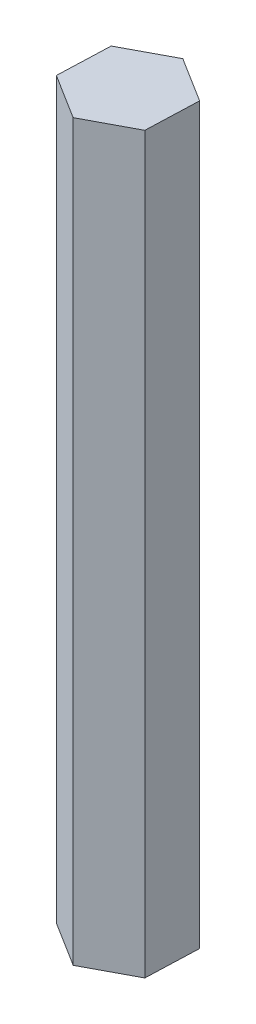
ISO-10303-21;
HEADER;
FILE_DESCRIPTION(('STEP AP214'),'2;1');
FILE_NAME('part.step','',(''),(''),'','','');
FILE_SCHEMA(('AUTOMOTIVE_DESIGN { 1 0 10303 214 1 1 1 1 }'));
ENDSEC;
DATA;
#1=APPLICATION_CONTEXT('core data for automotive mechanical design processes');
#2=APPLICATION_PROTOCOL_DEFINITION('international standard','automotive_design',2000,#1);
#3=PRODUCT_CONTEXT('',#1,'mechanical');
#4=PRODUCT('Part','Part','',(#3));
#5=PRODUCT_RELATED_PRODUCT_CATEGORY('part','',(#4));
#6=PRODUCT_DEFINITION_FORMATION('','',#4);
#7=PRODUCT_DEFINITION_CONTEXT('part definition',#1,'design');
#8=PRODUCT_DEFINITION('design','',#6,#7);
#9=PRODUCT_DEFINITION_SHAPE('','',#8);
#10=(LENGTH_UNIT() NAMED_UNIT(*) SI_UNIT(.MILLI.,.METRE.));
#11=(NAMED_UNIT(*) PLANE_ANGLE_UNIT() SI_UNIT($,.RADIAN.));
#12=(NAMED_UNIT(*) SI_UNIT($,.STERADIAN.) SOLID_ANGLE_UNIT());
#13=UNCERTAINTY_MEASURE_WITH_UNIT(LENGTH_MEASURE(1.E-05),#10,'distance_accuracy_value','');
#14=(GEOMETRIC_REPRESENTATION_CONTEXT(3) GLOBAL_UNCERTAINTY_ASSIGNED_CONTEXT((#13)) GLOBAL_UNIT_ASSIGNED_CONTEXT((#10,
#11,#12)) REPRESENTATION_CONTEXT('',''));
#15=CARTESIAN_POINT('',(0.,0.,0.));
#16=DIRECTION('',(0.,0.,1.));
#17=DIRECTION('',(1.,0.,0.));
#18=AXIS2_PLACEMENT_3D('',#15,#16,#17);
#19=CARTESIAN_POINT('',(3.10839587970355,50.8,1.94389001447493));
#20=DIRECTION('',(-0.999378260512364,0.,-0.0352575157275963));
#21=DIRECTION('',(-0.0352575157275963,0.,0.999378260512364));
#22=AXIS2_PLACEMENT_3D('',#19,#20,#21);
#23=PLANE('',#22);
#24=DIRECTION('',(0.0352575157275963,0.,-0.999378260512364));
#25=VECTOR('',#24,1.);
#26=CARTESIAN_POINT('',(3.10839587970355,0.,1.94389001447493));
#27=LINE('',#26,#25);
#28=CARTESIAN_POINT('',(3.10839587970355,0.,1.94389001447493));
#29=VERTEX_POINT('',#28);
#30=CARTESIAN_POINT('',(3.23765607454996,0.,-1.72000478960469));
#31=VERTEX_POINT('',#30);
#32=EDGE_CURVE('E117',#29,#31,#27,.T.);
#33=ORIENTED_EDGE('',*,*,#32,.T.);
#34=DIRECTION('',(0.,-1.,0.));
#35=VECTOR('',#34,1.);
#36=CARTESIAN_POINT('',(3.23765607454996,50.8,-1.72000478960469));
#37=LINE('',#36,#35);
#38=CARTESIAN_POINT('',(3.23765607454996,50.8,-1.72000478960469));
#39=VERTEX_POINT('',#38);
#40=EDGE_CURVE('E11',#39,#31,#37,.T.);
#41=ORIENTED_EDGE('',*,*,#40,.F.);
#42=DIRECTION('',(0.0352575157275963,0.,-0.999378260512364));
#43=VECTOR('',#42,1.);
#44=CARTESIAN_POINT('',(3.10839587970355,50.8,1.94389001447493));
#45=LINE('',#44,#43);
#46=CARTESIAN_POINT('',(3.10839587970355,50.8,1.94389001447493));
#47=VERTEX_POINT('',#46);
#48=EDGE_CURVE('E127',#47,#39,#45,.T.);
#49=ORIENTED_EDGE('',*,*,#48,.F.);
#50=DIRECTION('',(0.,-1.,0.));
#51=VECTOR('',#50,1.);
#52=CARTESIAN_POINT('',(3.10839587970355,50.8,1.94389001447493));
#53=LINE('',#52,#51);
#54=EDGE_CURVE('E113',#47,#29,#53,.T.);
#55=ORIENTED_EDGE('',*,*,#54,.T.);
#56=EDGE_LOOP('',(#33,#41,#49,#55));
#57=FACE_BOUND('',#56,.T.);
#58=ADVANCED_FACE('F33',(#57),#23,.F.);
#59=CARTESIAN_POINT('',(3.23765607454996,50.8,-1.72000478960469));
#60=DIRECTION('',(-0.53022303455061,0.,0.847858203729812));
#61=DIRECTION('',(0.847858203729812,0.,0.53022303455061));
#62=AXIS2_PLACEMENT_3D('',#59,#60,#61);
#63=PLANE('',#62);
#64=DIRECTION('',(-0.847858203729812,0.,-0.53022303455061));
#65=VECTOR('',#64,1.);
#66=CARTESIAN_POINT('',(3.23765607454996,0.,-1.72000478960469));
#67=LINE('',#66,#65);
#68=CARTESIAN_POINT('',(0.129260194846412,0.,-3.66389480407961));
#69=VERTEX_POINT('',#68);
#70=EDGE_CURVE('E120',#31,#69,#67,.T.);
#71=ORIENTED_EDGE('',*,*,#70,.T.);
#72=DIRECTION('',(0.,-1.,0.));
#73=VECTOR('',#72,1.);
#74=CARTESIAN_POINT('',(0.129260194846412,50.8,-3.66389480407961));
#75=LINE('',#74,#73);
#76=CARTESIAN_POINT('',(0.129260194846412,50.8,-3.66389480407961));
#77=VERTEX_POINT('',#76);
#78=EDGE_CURVE('E41',#77,#69,#75,.T.);
#79=ORIENTED_EDGE('',*,*,#78,.F.);
#80=DIRECTION('',(-0.847858203729812,0.,-0.53022303455061));
#81=VECTOR('',#80,1.);
#82=CARTESIAN_POINT('',(3.23765607454996,50.8,-1.72000478960469));
#83=LINE('',#82,#81);
#84=EDGE_CURVE('E86',#39,#77,#83,.T.);
#85=ORIENTED_EDGE('',*,*,#84,.F.);
#86=ORIENTED_EDGE('',*,*,#40,.T.);
#87=EDGE_LOOP('',(#71,#79,#85,#86));
#88=FACE_BOUND('',#87,.T.);
#89=ADVANCED_FACE('F151',(#88),#63,.F.);
#90=CARTESIAN_POINT('',(0.129260194846412,50.8,-3.66389480407961));
#91=DIRECTION('',(0.469155225961754,0.,0.883115719457408));
#92=DIRECTION('',(0.883115719457408,0.,-0.469155225961754));
#93=AXIS2_PLACEMENT_3D('',#90,#91,#92);
#94=PLANE('',#93);
#95=DIRECTION('',(-0.883115719457408,0.,0.469155225961754));
#96=VECTOR('',#95,1.);
#97=CARTESIAN_POINT('',(0.129260194846412,0.,-3.66389480407961));
#98=LINE('',#97,#96);
#99=CARTESIAN_POINT('',(-3.10839587970355,0.,-1.94389001447493));
#100=VERTEX_POINT('',#99);
#101=EDGE_CURVE('E122',#69,#100,#98,.T.);
#102=ORIENTED_EDGE('',*,*,#101,.T.);
#103=DIRECTION('',(0.,-1.,0.));
#104=VECTOR('',#103,1.);
#105=CARTESIAN_POINT('',(-3.10839587970355,50.8,-1.94389001447493));
#106=LINE('',#105,#104);
#107=CARTESIAN_POINT('',(-3.10839587970355,50.8,-1.94389001447493));
#108=VERTEX_POINT('',#107);
#109=EDGE_CURVE('E108',#108,#100,#106,.T.);
#110=ORIENTED_EDGE('',*,*,#109,.F.);
#111=DIRECTION('',(-0.883115719457408,0.,0.469155225961754));
#112=VECTOR('',#111,1.);
#113=CARTESIAN_POINT('',(0.129260194846412,50.8,-3.66389480407961));
#114=LINE('',#113,#112);
#115=EDGE_CURVE('E99',#77,#108,#114,.T.);
#116=ORIENTED_EDGE('',*,*,#115,.F.);
#117=ORIENTED_EDGE('',*,*,#78,.T.);
#118=EDGE_LOOP('',(#102,#110,#116,#117));
#119=FACE_BOUND('',#118,.T.);
#120=ADVANCED_FACE('F133',(#119),#94,.F.);
#121=CARTESIAN_POINT('',(-3.10839587970355,50.8,-1.94389001447493));
#122=DIRECTION('',(0.999378260512364,0.,0.0352575157275965));
#123=DIRECTION('',(0.0352575157275965,0.,-0.999378260512364));
#124=AXIS2_PLACEMENT_3D('',#121,#122,#123);
#125=PLANE('',#124);
#126=DIRECTION('',(-0.0352575157275965,0.,0.999378260512364));
#127=VECTOR('',#126,1.);
#128=CARTESIAN_POINT('',(-3.10839587970355,0.,-1.94389001447493));
#129=LINE('',#128,#127);
#130=CARTESIAN_POINT('',(-3.23765607454996,0.,1.72000478960469));
#131=VERTEX_POINT('',#130);
#132=EDGE_CURVE('E107',#100,#131,#129,.T.);
#133=ORIENTED_EDGE('',*,*,#132,.T.);
#134=DIRECTION('',(0.,-1.,0.));
#135=VECTOR('',#134,1.);
#136=CARTESIAN_POINT('',(-3.23765607454996,50.8,1.72000478960469));
#137=LINE('',#136,#135);
#138=CARTESIAN_POINT('',(-3.23765607454996,50.8,1.72000478960469));
#139=VERTEX_POINT('',#138);
#140=EDGE_CURVE('E104',#139,#131,#137,.T.);
#141=ORIENTED_EDGE('',*,*,#140,.F.);
#142=DIRECTION('',(-0.0352575157275965,0.,0.999378260512364));
#143=VECTOR('',#142,1.);
#144=CARTESIAN_POINT('',(-3.10839587970355,50.8,-1.94389001447493));
#145=LINE('',#144,#143);
#146=EDGE_CURVE('E93',#108,#139,#145,.T.);
#147=ORIENTED_EDGE('',*,*,#146,.F.);
#148=ORIENTED_EDGE('',*,*,#109,.T.);
#149=EDGE_LOOP('',(#133,#141,#147,#148));
#150=FACE_BOUND('',#149,.T.);
#151=ADVANCED_FACE('F105',(#150),#125,.F.);
#152=CARTESIAN_POINT('',(-3.23765607454996,50.8,1.72000478960469));
#153=DIRECTION('',(0.53022303455061,0.,-0.847858203729812));
#154=DIRECTION('',(-0.847858203729812,0.,-0.53022303455061));
#155=AXIS2_PLACEMENT_3D('',#152,#153,#154);
#156=PLANE('',#155);
#157=DIRECTION('',(0.847858203729812,0.,0.53022303455061));
#158=VECTOR('',#157,1.);
#159=CARTESIAN_POINT('',(-3.23765607454996,0.,1.72000478960469));
#160=LINE('',#159,#158);
#161=CARTESIAN_POINT('',(-0.129260194846412,0.,3.66389480407962));
#162=VERTEX_POINT('',#161);
#163=EDGE_CURVE('E72',#131,#162,#160,.T.);
#164=ORIENTED_EDGE('',*,*,#163,.T.);
#165=DIRECTION('',(0.,-1.,0.));
#166=VECTOR('',#165,1.);
#167=CARTESIAN_POINT('',(-0.129260194846412,50.8,3.66389480407962));
#168=LINE('',#167,#166);
#169=CARTESIAN_POINT('',(-0.129260194846412,50.8,3.66389480407962));
#170=VERTEX_POINT('',#169);
#171=EDGE_CURVE('E109',#170,#162,#168,.T.);
#172=ORIENTED_EDGE('',*,*,#171,.F.);
#173=DIRECTION('',(0.847858203729812,0.,0.53022303455061));
#174=VECTOR('',#173,1.);
#175=CARTESIAN_POINT('',(-3.23765607454996,50.8,1.72000478960469));
#176=LINE('',#175,#174);
#177=EDGE_CURVE('E97',#139,#170,#176,.T.);
#178=ORIENTED_EDGE('',*,*,#177,.F.);
#179=ORIENTED_EDGE('',*,*,#140,.T.);
#180=EDGE_LOOP('',(#164,#172,#178,#179));
#181=FACE_BOUND('',#180,.T.);
#182=ADVANCED_FACE('F111',(#181),#156,.F.);
#183=CARTESIAN_POINT('',(-0.129260194846412,50.8,3.66389480407962));
#184=DIRECTION('',(-0.469155225961754,0.,-0.883115719457408));
#185=DIRECTION('',(-0.883115719457408,0.,0.469155225961754));
#186=AXIS2_PLACEMENT_3D('',#183,#184,#185);
#187=PLANE('',#186);
#188=DIRECTION('',(0.883115719457408,0.,-0.469155225961754));
#189=VECTOR('',#188,1.);
#190=CARTESIAN_POINT('',(-0.129260194846412,0.,3.66389480407962));
#191=LINE('',#190,#189);
#192=EDGE_CURVE('E78',#162,#29,#191,.T.);
#193=ORIENTED_EDGE('',*,*,#192,.T.);
#194=ORIENTED_EDGE('',*,*,#54,.F.);
#195=DIRECTION('',(0.883115719457408,0.,-0.469155225961754));
#196=VECTOR('',#195,1.);
#197=CARTESIAN_POINT('',(-0.129260194846412,50.8,3.66389480407962));
#198=LINE('',#197,#196);
#199=EDGE_CURVE('E49',#170,#47,#198,.T.);
#200=ORIENTED_EDGE('',*,*,#199,.F.);
#201=ORIENTED_EDGE('',*,*,#171,.T.);
#202=EDGE_LOOP('',(#193,#194,#200,#201));
#203=FACE_BOUND('',#202,.T.);
#204=ADVANCED_FACE('F140',(#203),#187,.F.);
#205=CARTESIAN_POINT('',(0.,50.8,0.));
#206=DIRECTION('',(0.,1.,0.));
#207=DIRECTION('',(0.,0.,1.));
#208=AXIS2_PLACEMENT_3D('',#205,#206,#207);
#209=PLANE('',#208);
#210=ORIENTED_EDGE('',*,*,#48,.T.);
#211=ORIENTED_EDGE('',*,*,#84,.T.);
#212=ORIENTED_EDGE('',*,*,#115,.T.);
#213=ORIENTED_EDGE('',*,*,#146,.T.);
#214=ORIENTED_EDGE('',*,*,#177,.T.);
#215=ORIENTED_EDGE('',*,*,#199,.T.);
#216=EDGE_LOOP('',(#210,#211,#212,#213,#214,#215));
#217=FACE_BOUND('',#216,.T.);
#218=ADVANCED_FACE('F95',(#217),#209,.T.);
#219=CARTESIAN_POINT('',(0.,0.,0.));
#220=DIRECTION('',(0.,1.,0.));
#221=DIRECTION('',(0.,0.,1.));
#222=AXIS2_PLACEMENT_3D('',#219,#220,#221);
#223=PLANE('',#222);
#224=ORIENTED_EDGE('',*,*,#32,.F.);
#225=ORIENTED_EDGE('',*,*,#192,.F.);
#226=ORIENTED_EDGE('',*,*,#163,.F.);
#227=ORIENTED_EDGE('',*,*,#132,.F.);
#228=ORIENTED_EDGE('',*,*,#101,.F.);
#229=ORIENTED_EDGE('',*,*,#70,.F.);
#230=EDGE_LOOP('',(#224,#225,#226,#227,#228,#229));
#231=FACE_BOUND('',#230,.T.);
#232=ADVANCED_FACE('F136',(#231),#223,.F.);
#233=CLOSED_SHELL('',(#58,#89,#120,#151,#182,#204,#218,#232));
#234=MANIFOLD_SOLID_BREP('B2',#233);
#235=ADVANCED_BREP_SHAPE_REPRESENTATION('',(#18,#234),#14);
#236=SHAPE_DEFINITION_REPRESENTATION(#9,#235);
ENDSEC;
END-ISO-10303-21;
